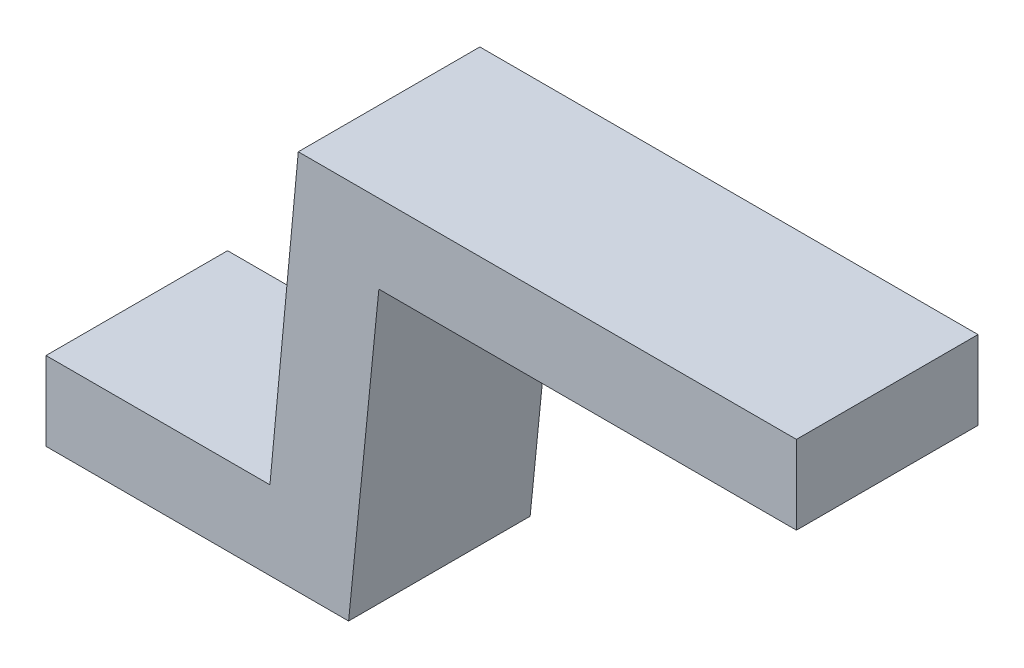
ISO-10303-21;
HEADER;
FILE_DESCRIPTION(('STEP AP214'),'2;1');
FILE_NAME('part.step','',(''),(''),'','','');
FILE_SCHEMA(('AUTOMOTIVE_DESIGN { 1 0 10303 214 1 1 1 1 }'));
ENDSEC;
DATA;
#1=APPLICATION_CONTEXT('core data for automotive mechanical design processes');
#2=APPLICATION_PROTOCOL_DEFINITION('international standard','automotive_design',2000,#1);
#3=PRODUCT_CONTEXT('',#1,'mechanical');
#4=PRODUCT('Part','Part','',(#3));
#5=PRODUCT_RELATED_PRODUCT_CATEGORY('part','',(#4));
#6=PRODUCT_DEFINITION_FORMATION('','',#4);
#7=PRODUCT_DEFINITION_CONTEXT('part definition',#1,'design');
#8=PRODUCT_DEFINITION('design','',#6,#7);
#9=PRODUCT_DEFINITION_SHAPE('','',#8);
#10=(LENGTH_UNIT() NAMED_UNIT(*) SI_UNIT(.MILLI.,.METRE.));
#11=(NAMED_UNIT(*) PLANE_ANGLE_UNIT() SI_UNIT($,.RADIAN.));
#12=(NAMED_UNIT(*) SI_UNIT($,.STERADIAN.) SOLID_ANGLE_UNIT());
#13=UNCERTAINTY_MEASURE_WITH_UNIT(LENGTH_MEASURE(1.E-05),#10,'distance_accuracy_value','');
#14=(GEOMETRIC_REPRESENTATION_CONTEXT(3) GLOBAL_UNCERTAINTY_ASSIGNED_CONTEXT((#13)) GLOBAL_UNIT_ASSIGNED_CONTEXT((#10,
#11,#12)) REPRESENTATION_CONTEXT('',''));
#15=CARTESIAN_POINT('',(0.,0.,0.));
#16=DIRECTION('',(0.,0.,1.));
#17=DIRECTION('',(1.,0.,0.));
#18=AXIS2_PLACEMENT_3D('',#15,#16,#17);
#19=CARTESIAN_POINT('',(-0.61999876,-0.31500064,0.));
#20=DIRECTION('',(0.,1.,0.));
#21=DIRECTION('',(0.,0.,1.));
#22=AXIS2_PLACEMENT_3D('',#19,#20,#21);
#23=PLANE('',#22);
#24=DIRECTION('',(-1.,0.,0.));
#25=VECTOR('',#24,1.);
#26=CARTESIAN_POINT('',(-0.61999876,-0.31500064,0.3));
#27=LINE('',#26,#25);
#28=CARTESIAN_POINT('',(-0.11999976,-0.31500064,0.3));
#29=VERTEX_POINT('',#28);
#30=CARTESIAN_POINT('',(-0.61999876,-0.31500064,0.3));
#31=VERTEX_POINT('',#30);
#32=EDGE_CURVE('E130',#29,#31,#27,.T.);
#33=ORIENTED_EDGE('',*,*,#32,.T.);
#34=DIRECTION('',(0.,0.,-1.));
#35=VECTOR('',#34,1.);
#36=CARTESIAN_POINT('',(-0.61999876,-0.31500064,0.));
#37=LINE('',#36,#35);
#38=CARTESIAN_POINT('',(-0.61999876,-0.31500064,0.));
#39=VERTEX_POINT('',#38);
#40=EDGE_CURVE('E20',#31,#39,#37,.T.);
#41=ORIENTED_EDGE('',*,*,#40,.T.);
#42=DIRECTION('',(-1.,0.,0.));
#43=VECTOR('',#42,1.);
#44=CARTESIAN_POINT('',(-0.61999876,-0.31500064,0.));
#45=LINE('',#44,#43);
#46=CARTESIAN_POINT('',(-0.11999976,-0.31500064,0.));
#47=VERTEX_POINT('',#46);
#48=EDGE_CURVE('E97',#47,#39,#45,.T.);
#49=ORIENTED_EDGE('',*,*,#48,.F.);
#50=DIRECTION('',(0.,0.,1.));
#51=VECTOR('',#50,1.);
#52=CARTESIAN_POINT('',(-0.11999976,-0.31500064,0.));
#53=LINE('',#52,#51);
#54=EDGE_CURVE('E85',#47,#29,#53,.T.);
#55=ORIENTED_EDGE('',*,*,#54,.T.);
#56=EDGE_LOOP('',(#33,#41,#49,#55));
#57=FACE_BOUND('',#56,.T.);
#58=ADVANCED_FACE('F17',(#57),#23,.F.);
#59=CARTESIAN_POINT('',(-0.61999876,-0.1850009,0.));
#60=DIRECTION('',(1.,0.,0.));
#61=DIRECTION('',(0.,0.,-1.));
#62=AXIS2_PLACEMENT_3D('',#59,#60,#61);
#63=PLANE('',#62);
#64=DIRECTION('',(0.,1.,0.));
#65=VECTOR('',#64,1.);
#66=CARTESIAN_POINT('',(-0.61999876,-0.31500064,0.3));
#67=LINE('',#66,#65);
#68=CARTESIAN_POINT('',(-0.61999876,-0.1850009,0.3));
#69=VERTEX_POINT('',#68);
#70=EDGE_CURVE('E116',#31,#69,#67,.T.);
#71=ORIENTED_EDGE('',*,*,#70,.T.);
#72=DIRECTION('',(0.,0.,-1.));
#73=VECTOR('',#72,1.);
#74=CARTESIAN_POINT('',(-0.61999876,-0.1850009,0.));
#75=LINE('',#74,#73);
#76=CARTESIAN_POINT('',(-0.61999876,-0.1850009,0.));
#77=VERTEX_POINT('',#76);
#78=EDGE_CURVE('E100',#69,#77,#75,.T.);
#79=ORIENTED_EDGE('',*,*,#78,.T.);
#80=DIRECTION('',(0.,1.,0.));
#81=VECTOR('',#80,1.);
#82=CARTESIAN_POINT('',(-0.61999876,-0.31500064,0.));
#83=LINE('',#82,#81);
#84=EDGE_CURVE('E103',#39,#77,#83,.T.);
#85=ORIENTED_EDGE('',*,*,#84,.F.);
#86=ORIENTED_EDGE('',*,*,#40,.F.);
#87=EDGE_LOOP('',(#71,#79,#85,#86));
#88=FACE_BOUND('',#87,.T.);
#89=ADVANCED_FACE('F114',(#88),#63,.F.);
#90=CARTESIAN_POINT('',(-0.06999986,0.18499836,0.));
#91=DIRECTION('',(0.,1.,0.));
#92=DIRECTION('',(0.,0.,1.));
#93=AXIS2_PLACEMENT_3D('',#90,#91,#92);
#94=PLANE('',#93);
#95=DIRECTION('',(-1.,0.,0.));
#96=VECTOR('',#95,1.);
#97=CARTESIAN_POINT('',(-0.61999876,0.18499836,0.3));
#98=LINE('',#97,#96);
#99=CARTESIAN_POINT('',(0.6200013,0.18499836,0.3));
#100=VERTEX_POINT('',#99);
#101=CARTESIAN_POINT('',(-0.06999986,0.18499836,0.3));
#102=VERTEX_POINT('',#101);
#103=EDGE_CURVE('E138',#100,#102,#98,.T.);
#104=ORIENTED_EDGE('',*,*,#103,.T.);
#105=DIRECTION('',(0.,0.,1.));
#106=VECTOR('',#105,1.);
#107=CARTESIAN_POINT('',(-0.06999986,0.18499836,0.));
#108=LINE('',#107,#106);
#109=CARTESIAN_POINT('',(-0.06999986,0.18499836,0.));
#110=VERTEX_POINT('',#109);
#111=EDGE_CURVE('E78',#102,#110,#108,.F.);
#112=ORIENTED_EDGE('',*,*,#111,.T.);
#113=DIRECTION('',(-1.,0.,0.));
#114=VECTOR('',#113,1.);
#115=CARTESIAN_POINT('',(-0.61999876,0.18499836,0.));
#116=LINE('',#115,#114);
#117=CARTESIAN_POINT('',(0.6200013,0.18499836,0.));
#118=VERTEX_POINT('',#117);
#119=EDGE_CURVE('E99',#118,#110,#116,.T.);
#120=ORIENTED_EDGE('',*,*,#119,.F.);
#121=DIRECTION('',(0.,0.,1.));
#122=VECTOR('',#121,1.);
#123=CARTESIAN_POINT('',(0.6200013,0.18499836,0.));
#124=LINE('',#123,#122);
#125=EDGE_CURVE('E128',#118,#100,#124,.T.);
#126=ORIENTED_EDGE('',*,*,#125,.T.);
#127=EDGE_LOOP('',(#104,#112,#120,#126));
#128=FACE_BOUND('',#127,.T.);
#129=ADVANCED_FACE('F181',(#128),#94,.F.);
#130=CARTESIAN_POINT('',(-0.11999976,-0.31500064,0.));
#131=DIRECTION('',(-0.995037190209989,0.0995037190209989,0.));
#132=DIRECTION('',(-0.0995037190209989,-0.995037190209989,0.));
#133=AXIS2_PLACEMENT_3D('',#130,#131,#132);
#134=PLANE('',#133);
#135=DIRECTION('',(-0.0995037190209989,-0.995037190209989,0.));
#136=VECTOR('',#135,1.);
#137=CARTESIAN_POINT('',(-0.06999986,0.18499836,0.3));
#138=LINE('',#137,#136);
#139=EDGE_CURVE('E90',#102,#29,#138,.T.);
#140=ORIENTED_EDGE('',*,*,#139,.T.);
#141=ORIENTED_EDGE('',*,*,#54,.F.);
#142=DIRECTION('',(-0.0995037190209989,-0.995037190209989,0.));
#143=VECTOR('',#142,1.);
#144=CARTESIAN_POINT('',(-0.06999986,0.18499836,0.));
#145=LINE('',#144,#143);
#146=EDGE_CURVE('E88',#110,#47,#145,.T.);
#147=ORIENTED_EDGE('',*,*,#146,.F.);
#148=ORIENTED_EDGE('',*,*,#111,.F.);
#149=EDGE_LOOP('',(#140,#141,#147,#148));
#150=FACE_BOUND('',#149,.T.);
#151=ADVANCED_FACE('F87',(#150),#134,.F.);
#152=CARTESIAN_POINT('',(-0.2499995,-0.1850009,0.));
#153=DIRECTION('',(0.,-1.,0.));
#154=DIRECTION('',(0.,0.,-1.));
#155=AXIS2_PLACEMENT_3D('',#152,#153,#154);
#156=PLANE('',#155);
#157=DIRECTION('',(-1.,0.,0.));
#158=VECTOR('',#157,1.);
#159=CARTESIAN_POINT('',(-0.61999876,-0.1850009,0.3));
#160=LINE('',#159,#158);
#161=CARTESIAN_POINT('',(-0.249999499999993,-0.185000900000001,0.3));
#162=VERTEX_POINT('',#161);
#163=EDGE_CURVE('E133',#69,#162,#160,.F.);
#164=ORIENTED_EDGE('',*,*,#163,.T.);
#165=DIRECTION('',(0.,0.,1.));
#166=VECTOR('',#165,1.);
#167=CARTESIAN_POINT('',(-0.249999499999973,-0.185000900000003,0.));
#168=LINE('',#167,#166);
#169=CARTESIAN_POINT('',(-0.249999499999993,-0.185000900000001,0.));
#170=VERTEX_POINT('',#169);
#171=EDGE_CURVE('E121',#162,#170,#168,.F.);
#172=ORIENTED_EDGE('',*,*,#171,.T.);
#173=DIRECTION('',(-1.,0.,0.));
#174=VECTOR('',#173,1.);
#175=CARTESIAN_POINT('',(-0.61999876,-0.1850009,0.));
#176=LINE('',#175,#174);
#177=EDGE_CURVE('E105',#77,#170,#176,.F.);
#178=ORIENTED_EDGE('',*,*,#177,.F.);
#179=ORIENTED_EDGE('',*,*,#78,.F.);
#180=EDGE_LOOP('',(#164,#172,#178,#179));
#181=FACE_BOUND('',#180,.T.);
#182=ADVANCED_FACE('F120',(#181),#156,.F.);
#183=CARTESIAN_POINT('',(-0.61999876,-0.31500064,0.));
#184=DIRECTION('',(0.,0.,-1.));
#185=DIRECTION('',(-1.,0.,0.));
#186=AXIS2_PLACEMENT_3D('',#183,#184,#185);
#187=PLANE('',#186);
#188=DIRECTION('',(0.,1.,0.));
#189=VECTOR('',#188,1.);
#190=CARTESIAN_POINT('',(0.6200013,0.18499836,0.));
#191=LINE('',#190,#189);
#192=CARTESIAN_POINT('',(0.62000129999951,0.31499952875,0.));
#193=VERTEX_POINT('',#192);
#194=EDGE_CURVE('E124',#193,#118,#191,.F.);
#195=ORIENTED_EDGE('',*,*,#194,.T.);
#196=ORIENTED_EDGE('',*,*,#119,.T.);
#197=ORIENTED_EDGE('',*,*,#146,.T.);
#198=ORIENTED_EDGE('',*,*,#48,.T.);
#199=ORIENTED_EDGE('',*,*,#84,.T.);
#200=ORIENTED_EDGE('',*,*,#177,.T.);
#201=DIRECTION('',(0.0933418054485064,0.995634123237855,0.));
#202=VECTOR('',#201,1.);
#203=CARTESIAN_POINT('',(-0.2031238,0.31500064,0.));
#204=LINE('',#203,#202);
#205=CARTESIAN_POINT('',(-0.2031238,0.31500064,0.));
#206=VERTEX_POINT('',#205);
#207=EDGE_CURVE('E141',#170,#206,#204,.T.);
#208=ORIENTED_EDGE('',*,*,#207,.T.);
#209=DIRECTION('',(0.999999999995239,-3.08580068879274E-06,0.));
#210=VECTOR('',#209,1.);
#211=CARTESIAN_POINT('',(0.6200013,0.3149981,0.));
#212=LINE('',#211,#210);
#213=EDGE_CURVE('E145',#206,#193,#212,.T.);
#214=ORIENTED_EDGE('',*,*,#213,.T.);
#215=EDGE_LOOP('',(#195,#196,#197,#198,#199,#200,#208,#214));
#216=FACE_BOUND('',#215,.T.);
#217=ADVANCED_FACE('F96',(#216),#187,.T.);
#218=CARTESIAN_POINT('',(0.6200013,0.18499836,0.));
#219=DIRECTION('',(-1.,0.,0.));
#220=DIRECTION('',(0.,0.,1.));
#221=AXIS2_PLACEMENT_3D('',#218,#219,#220);
#222=PLANE('',#221);
#223=DIRECTION('',(0.,1.,0.));
#224=VECTOR('',#223,1.);
#225=CARTESIAN_POINT('',(0.6200013,-0.31500064,0.3));
#226=LINE('',#225,#224);
#227=CARTESIAN_POINT('',(0.62000129999951,0.3149990525,0.3));
#228=VERTEX_POINT('',#227);
#229=EDGE_CURVE('E135',#228,#100,#226,.F.);
#230=ORIENTED_EDGE('',*,*,#229,.T.);
#231=ORIENTED_EDGE('',*,*,#125,.F.);
#232=ORIENTED_EDGE('',*,*,#194,.F.);
#233=DIRECTION('',(0.,0.,1.));
#234=VECTOR('',#233,1.);
#235=CARTESIAN_POINT('',(0.620001299998041,0.3149981,0.));
#236=LINE('',#235,#234);
#237=EDGE_CURVE('E148',#193,#228,#236,.T.);
#238=ORIENTED_EDGE('',*,*,#237,.T.);
#239=EDGE_LOOP('',(#230,#231,#232,#238));
#240=FACE_BOUND('',#239,.T.);
#241=ADVANCED_FACE('F160',(#240),#222,.F.);
#242=CARTESIAN_POINT('',(-0.61999876,-0.31500064,0.3));
#243=DIRECTION('',(0.,0.,-1.));
#244=DIRECTION('',(-1.,0.,0.));
#245=AXIS2_PLACEMENT_3D('',#242,#243,#244);
#246=PLANE('',#245);
#247=ORIENTED_EDGE('',*,*,#103,.F.);
#248=ORIENTED_EDGE('',*,*,#229,.F.);
#249=DIRECTION('',(0.999999999995239,-3.08580068879274E-06,0.));
#250=VECTOR('',#249,1.);
#251=CARTESIAN_POINT('',(0.6200013,0.3149981,0.3));
#252=LINE('',#251,#250);
#253=CARTESIAN_POINT('',(-0.2031238,0.31500064,0.3));
#254=VERTEX_POINT('',#253);
#255=EDGE_CURVE('E26',#228,#254,#252,.F.);
#256=ORIENTED_EDGE('',*,*,#255,.T.);
#257=DIRECTION('',(0.0933418054485064,0.995634123237855,0.));
#258=VECTOR('',#257,1.);
#259=CARTESIAN_POINT('',(-0.2031238,0.31500064,0.3));
#260=LINE('',#259,#258);
#261=EDGE_CURVE('E34',#254,#162,#260,.F.);
#262=ORIENTED_EDGE('',*,*,#261,.T.);
#263=ORIENTED_EDGE('',*,*,#163,.F.);
#264=ORIENTED_EDGE('',*,*,#70,.F.);
#265=ORIENTED_EDGE('',*,*,#32,.F.);
#266=ORIENTED_EDGE('',*,*,#139,.F.);
#267=EDGE_LOOP('',(#247,#248,#256,#262,#263,#264,#265,#266));
#268=FACE_BOUND('',#267,.T.);
#269=ADVANCED_FACE('F155',(#268),#246,.F.);
#270=CARTESIAN_POINT('',(-0.2031238,0.31500064,0.));
#271=DIRECTION('',(0.995634123237855,-0.0933418054485064,0.));
#272=DIRECTION('',(0.0933418054485064,0.995634123237855,0.));
#273=AXIS2_PLACEMENT_3D('',#270,#271,#272);
#274=PLANE('',#273);
#275=ORIENTED_EDGE('',*,*,#261,.F.);
#276=DIRECTION('',(0.,0.,1.));
#277=VECTOR('',#276,1.);
#278=CARTESIAN_POINT('',(-0.2031238,0.315000640000001,0.));
#279=LINE('',#278,#277);
#280=EDGE_CURVE('E11',#254,#206,#279,.F.);
#281=ORIENTED_EDGE('',*,*,#280,.T.);
#282=ORIENTED_EDGE('',*,*,#207,.F.);
#283=ORIENTED_EDGE('',*,*,#171,.F.);
#284=EDGE_LOOP('',(#275,#281,#282,#283));
#285=FACE_BOUND('',#284,.T.);
#286=ADVANCED_FACE('F162',(#285),#274,.F.);
#287=CARTESIAN_POINT('',(0.6200013,0.3149981,0.));
#288=DIRECTION('',(-3.08580068879274E-06,-0.999999999995239,0.));
#289=DIRECTION('',(0.999999999995239,-3.08580068879274E-06,0.));
#290=AXIS2_PLACEMENT_3D('',#287,#288,#289);
#291=PLANE('',#290);
#292=ORIENTED_EDGE('',*,*,#255,.F.);
#293=ORIENTED_EDGE('',*,*,#237,.F.);
#294=ORIENTED_EDGE('',*,*,#213,.F.);
#295=ORIENTED_EDGE('',*,*,#280,.F.);
#296=EDGE_LOOP('',(#292,#293,#294,#295));
#297=FACE_BOUND('',#296,.T.);
#298=ADVANCED_FACE('F158',(#297),#291,.F.);
#299=CLOSED_SHELL('',(#58,#89,#129,#151,#182,#217,#241,#269,#286,#298));
#300=MANIFOLD_SOLID_BREP('B1',#299);
#301=ADVANCED_BREP_SHAPE_REPRESENTATION('',(#18,#300),#14);
#302=SHAPE_DEFINITION_REPRESENTATION(#9,#301);
ENDSEC;
END-ISO-10303-21;
